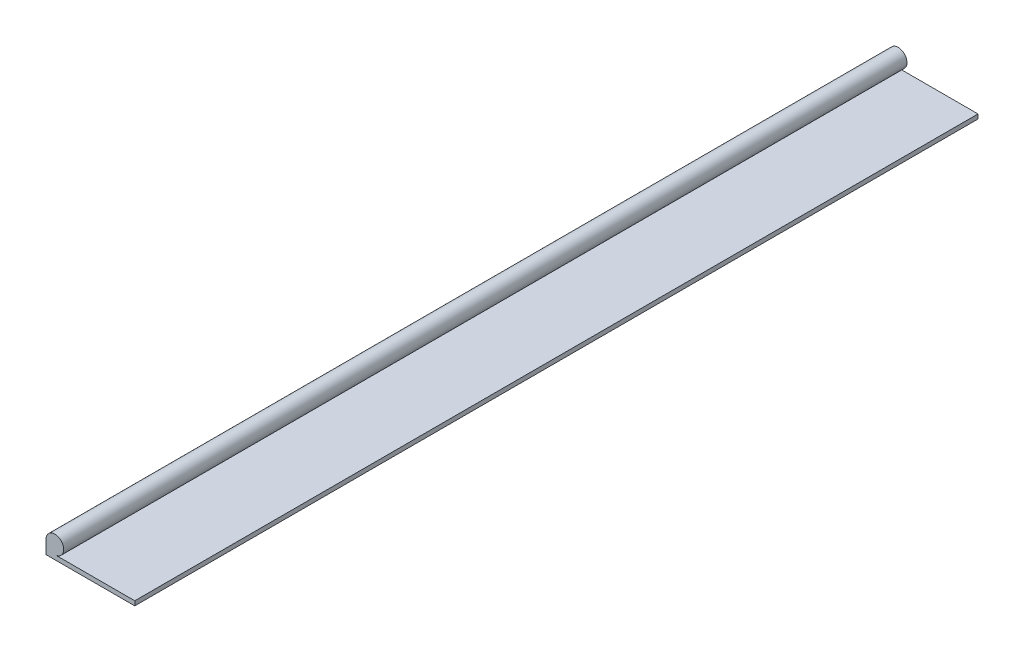
ISO-10303-21;
HEADER;
FILE_DESCRIPTION(('STEP AP214'),'2;1');
FILE_NAME('part.step','',(''),(''),'','','');
FILE_SCHEMA(('AUTOMOTIVE_DESIGN { 1 0 10303 214 1 1 1 1 }'));
ENDSEC;
DATA;
#1=APPLICATION_CONTEXT('core data for automotive mechanical design processes');
#2=APPLICATION_PROTOCOL_DEFINITION('international standard','automotive_design',2000,#1);
#3=PRODUCT_CONTEXT('',#1,'mechanical');
#4=PRODUCT('Part','Part','',(#3));
#5=PRODUCT_RELATED_PRODUCT_CATEGORY('part','',(#4));
#6=PRODUCT_DEFINITION_FORMATION('','',#4);
#7=PRODUCT_DEFINITION_CONTEXT('part definition',#1,'design');
#8=PRODUCT_DEFINITION('design','',#6,#7);
#9=PRODUCT_DEFINITION_SHAPE('','',#8);
#10=(LENGTH_UNIT() NAMED_UNIT(*) SI_UNIT(.MILLI.,.METRE.));
#11=(NAMED_UNIT(*) PLANE_ANGLE_UNIT() SI_UNIT($,.RADIAN.));
#12=(NAMED_UNIT(*) SI_UNIT($,.STERADIAN.) SOLID_ANGLE_UNIT());
#13=UNCERTAINTY_MEASURE_WITH_UNIT(LENGTH_MEASURE(1.E-05),#10,'distance_accuracy_value','');
#14=(GEOMETRIC_REPRESENTATION_CONTEXT(3) GLOBAL_UNCERTAINTY_ASSIGNED_CONTEXT((#13)) GLOBAL_UNIT_ASSIGNED_CONTEXT((#10,
#11,#12)) REPRESENTATION_CONTEXT('',''));
#15=CARTESIAN_POINT('',(0.,0.,0.));
#16=DIRECTION('',(0.,0.,1.));
#17=DIRECTION('',(1.,0.,0.));
#18=AXIS2_PLACEMENT_3D('',#15,#16,#17);
#19=CARTESIAN_POINT('',(0.,0.,241.3));
#20=DIRECTION('',(-1.,0.,0.));
#21=DIRECTION('',(0.,0.,1.));
#22=AXIS2_PLACEMENT_3D('',#19,#20,#21);
#23=PLANE('',#22);
#24=DIRECTION('',(0.,1.,0.));
#25=VECTOR('',#24,1.);
#26=CARTESIAN_POINT('',(0.,0.,0.));
#27=LINE('',#26,#25);
#28=CARTESIAN_POINT('',(0.,0.,0.));
#29=VERTEX_POINT('',#28);
#30=CARTESIAN_POINT('',(0.,1.27,0.));
#31=VERTEX_POINT('',#30);
#32=EDGE_CURVE('E108',#29,#31,#27,.T.);
#33=ORIENTED_EDGE('',*,*,#32,.T.);
#34=DIRECTION('',(0.,0.,-1.));
#35=VECTOR('',#34,1.);
#36=CARTESIAN_POINT('',(0.,1.27,241.3));
#37=LINE('',#36,#35);
#38=CARTESIAN_POINT('',(0.,1.27,241.3));
#39=VERTEX_POINT('',#38);
#40=EDGE_CURVE('E11',#39,#31,#37,.T.);
#41=ORIENTED_EDGE('',*,*,#40,.F.);
#42=DIRECTION('',(0.,1.,0.));
#43=VECTOR('',#42,1.);
#44=CARTESIAN_POINT('',(0.,0.,241.3));
#45=LINE('',#44,#43);
#46=CARTESIAN_POINT('',(0.,0.,241.3));
#47=VERTEX_POINT('',#46);
#48=EDGE_CURVE('E116',#47,#39,#45,.T.);
#49=ORIENTED_EDGE('',*,*,#48,.F.);
#50=DIRECTION('',(0.,0.,-1.));
#51=VECTOR('',#50,1.);
#52=CARTESIAN_POINT('',(0.,0.,241.3));
#53=LINE('',#52,#51);
#54=EDGE_CURVE('E104',#47,#29,#53,.T.);
#55=ORIENTED_EDGE('',*,*,#54,.T.);
#56=EDGE_LOOP('',(#33,#41,#49,#55));
#57=FACE_BOUND('',#56,.T.);
#58=ADVANCED_FACE('F34',(#57),#23,.F.);
#59=CARTESIAN_POINT('',(0.,1.27,241.3));
#60=DIRECTION('',(0.,-1.,0.));
#61=DIRECTION('',(1.,0.,0.));
#62=AXIS2_PLACEMENT_3D('',#59,#60,#61);
#63=PLANE('',#62);
#64=DIRECTION('',(-1.,0.,0.));
#65=VECTOR('',#64,1.);
#66=CARTESIAN_POINT('',(0.,1.27,0.));
#67=LINE('',#66,#65);
#68=CARTESIAN_POINT('',(-22.86,1.27,0.));
#69=VERTEX_POINT('',#68);
#70=EDGE_CURVE('E111',#31,#69,#67,.T.);
#71=ORIENTED_EDGE('',*,*,#70,.T.);
#72=DIRECTION('',(0.,0.,-1.));
#73=VECTOR('',#72,1.);
#74=CARTESIAN_POINT('',(-22.86,1.27,241.3));
#75=LINE('',#74,#73);
#76=CARTESIAN_POINT('',(-22.86,1.27,241.3));
#77=VERTEX_POINT('',#76);
#78=EDGE_CURVE('E42',#77,#69,#75,.T.);
#79=ORIENTED_EDGE('',*,*,#78,.F.);
#80=DIRECTION('',(-1.,0.,0.));
#81=VECTOR('',#80,1.);
#82=CARTESIAN_POINT('',(0.,1.27,241.3));
#83=LINE('',#82,#81);
#84=EDGE_CURVE('E83',#39,#77,#83,.T.);
#85=ORIENTED_EDGE('',*,*,#84,.F.);
#86=ORIENTED_EDGE('',*,*,#40,.T.);
#87=EDGE_LOOP('',(#71,#79,#85,#86));
#88=FACE_BOUND('',#87,.T.);
#89=ADVANCED_FACE('F135',(#88),#63,.F.);
#90=CARTESIAN_POINT('',(-22.86,3.81,241.3));
#91=DIRECTION('',(0.,0.,-1.));
#92=DIRECTION('',(-1.,0.,0.));
#93=AXIS2_PLACEMENT_3D('',#90,#91,#92);
#94=CYLINDRICAL_SURFACE('',#93,2.54);
#95=CARTESIAN_POINT('',(-22.86,3.81,0.));
#96=DIRECTION('',(0.,0.,1.));
#97=DIRECTION('',(1.,0.,0.));
#98=AXIS2_PLACEMENT_3D('',#95,#96,#97);
#99=CIRCLE('',#98,2.54);
#100=CARTESIAN_POINT('',(-25.4,3.81,0.));
#101=VERTEX_POINT('',#100);
#102=EDGE_CURVE('E99',#69,#101,#99,.T.);
#103=ORIENTED_EDGE('',*,*,#102,.T.);
#104=DIRECTION('',(0.,0.,-1.));
#105=VECTOR('',#104,1.);
#106=CARTESIAN_POINT('',(-25.4,3.81,241.3));
#107=LINE('',#106,#105);
#108=CARTESIAN_POINT('',(-25.4,3.81,241.3));
#109=VERTEX_POINT('',#108);
#110=EDGE_CURVE('E96',#109,#101,#107,.T.);
#111=ORIENTED_EDGE('',*,*,#110,.F.);
#112=CARTESIAN_POINT('',(-22.86,3.81,241.3));
#113=DIRECTION('',(0.,0.,1.));
#114=DIRECTION('',(1.,0.,0.));
#115=AXIS2_PLACEMENT_3D('',#112,#113,#114);
#116=CIRCLE('',#115,2.54);
#117=EDGE_CURVE('E87',#77,#109,#116,.T.);
#118=ORIENTED_EDGE('',*,*,#117,.F.);
#119=ORIENTED_EDGE('',*,*,#78,.T.);
#120=EDGE_LOOP('',(#103,#111,#118,#119));
#121=FACE_BOUND('',#120,.T.);
#122=ADVANCED_FACE('F97',(#121),#94,.T.);
#123=CARTESIAN_POINT('',(-25.4,0.,241.3));
#124=DIRECTION('',(1.,0.,0.));
#125=DIRECTION('',(0.,0.,-1.));
#126=AXIS2_PLACEMENT_3D('',#123,#124,#125);
#127=PLANE('',#126);
#128=DIRECTION('',(0.,-1.,0.));
#129=VECTOR('',#128,1.);
#130=CARTESIAN_POINT('',(-25.4,0.,0.));
#131=LINE('',#130,#129);
#132=CARTESIAN_POINT('',(-25.4,0.,0.));
#133=VERTEX_POINT('',#132);
#134=EDGE_CURVE('E69',#101,#133,#131,.T.);
#135=ORIENTED_EDGE('',*,*,#134,.T.);
#136=DIRECTION('',(0.,0.,-1.));
#137=VECTOR('',#136,1.);
#138=CARTESIAN_POINT('',(-25.4,0.,241.3));
#139=LINE('',#138,#137);
#140=CARTESIAN_POINT('',(-25.4,0.,241.3));
#141=VERTEX_POINT('',#140);
#142=EDGE_CURVE('E100',#141,#133,#139,.T.);
#143=ORIENTED_EDGE('',*,*,#142,.F.);
#144=DIRECTION('',(0.,-1.,0.));
#145=VECTOR('',#144,1.);
#146=CARTESIAN_POINT('',(-25.4,1.27,241.3));
#147=LINE('',#146,#145);
#148=EDGE_CURVE('E91',#109,#141,#147,.T.);
#149=ORIENTED_EDGE('',*,*,#148,.F.);
#150=ORIENTED_EDGE('',*,*,#110,.T.);
#151=EDGE_LOOP('',(#135,#143,#149,#150));
#152=FACE_BOUND('',#151,.T.);
#153=ADVANCED_FACE('F102',(#152),#127,.F.);
#154=CARTESIAN_POINT('',(0.,0.,241.3));
#155=DIRECTION('',(0.,1.,0.));
#156=DIRECTION('',(-1.,0.,0.));
#157=AXIS2_PLACEMENT_3D('',#154,#155,#156);
#158=PLANE('',#157);
#159=DIRECTION('',(1.,0.,0.));
#160=VECTOR('',#159,1.);
#161=CARTESIAN_POINT('',(0.,0.,0.));
#162=LINE('',#161,#160);
#163=EDGE_CURVE('E75',#133,#29,#162,.T.);
#164=ORIENTED_EDGE('',*,*,#163,.T.);
#165=ORIENTED_EDGE('',*,*,#54,.F.);
#166=DIRECTION('',(1.,0.,0.));
#167=VECTOR('',#166,1.);
#168=CARTESIAN_POINT('',(0.,0.,241.3));
#169=LINE('',#168,#167);
#170=EDGE_CURVE('E50',#141,#47,#169,.T.);
#171=ORIENTED_EDGE('',*,*,#170,.F.);
#172=ORIENTED_EDGE('',*,*,#142,.T.);
#173=EDGE_LOOP('',(#164,#165,#171,#172));
#174=FACE_BOUND('',#173,.T.);
#175=ADVANCED_FACE('F124',(#174),#158,.F.);
#176=CARTESIAN_POINT('',(-22.86,3.81,241.3));
#177=DIRECTION('',(0.,0.,1.));
#178=DIRECTION('',(1.,0.,0.));
#179=AXIS2_PLACEMENT_3D('',#176,#177,#178);
#180=PLANE('',#179);
#181=ORIENTED_EDGE('',*,*,#48,.T.);
#182=ORIENTED_EDGE('',*,*,#84,.T.);
#183=ORIENTED_EDGE('',*,*,#117,.T.);
#184=ORIENTED_EDGE('',*,*,#148,.T.);
#185=ORIENTED_EDGE('',*,*,#170,.T.);
#186=EDGE_LOOP('',(#181,#182,#183,#184,#185));
#187=FACE_BOUND('',#186,.T.);
#188=ADVANCED_FACE('F89',(#187),#180,.T.);
#189=CARTESIAN_POINT('',(-22.86,3.81,0.));
#190=DIRECTION('',(0.,0.,1.));
#191=DIRECTION('',(1.,0.,0.));
#192=AXIS2_PLACEMENT_3D('',#189,#190,#191);
#193=PLANE('',#192);
#194=ORIENTED_EDGE('',*,*,#32,.F.);
#195=ORIENTED_EDGE('',*,*,#163,.F.);
#196=ORIENTED_EDGE('',*,*,#134,.F.);
#197=ORIENTED_EDGE('',*,*,#102,.F.);
#198=ORIENTED_EDGE('',*,*,#70,.F.);
#199=EDGE_LOOP('',(#194,#195,#196,#197,#198));
#200=FACE_BOUND('',#199,.T.);
#201=ADVANCED_FACE('F120',(#200),#193,.F.);
#202=CLOSED_SHELL('',(#58,#89,#122,#153,#175,#188,#201));
#203=MANIFOLD_SOLID_BREP('B2',#202);
#204=ADVANCED_BREP_SHAPE_REPRESENTATION('',(#18,#203),#14);
#205=SHAPE_DEFINITION_REPRESENTATION(#9,#204);
ENDSEC;
END-ISO-10303-21;
